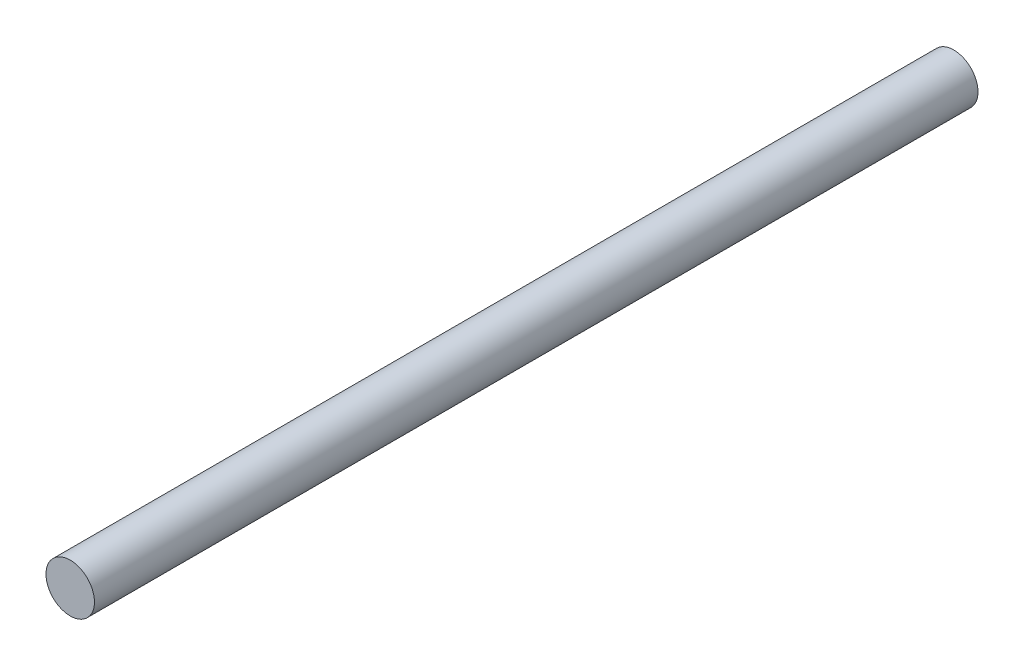
ISO-10303-21;
HEADER;
FILE_DESCRIPTION(('STEP AP214'),'2;1');
FILE_NAME('part.step','',(''),(''),'','','');
FILE_SCHEMA(('AUTOMOTIVE_DESIGN { 1 0 10303 214 1 1 1 1 }'));
ENDSEC;
DATA;
#1=APPLICATION_CONTEXT('core data for automotive mechanical design processes');
#2=APPLICATION_PROTOCOL_DEFINITION('international standard','automotive_design',2000,#1);
#3=PRODUCT_CONTEXT('',#1,'mechanical');
#4=PRODUCT('Part','Part','',(#3));
#5=PRODUCT_RELATED_PRODUCT_CATEGORY('part','',(#4));
#6=PRODUCT_DEFINITION_FORMATION('','',#4);
#7=PRODUCT_DEFINITION_CONTEXT('part definition',#1,'design');
#8=PRODUCT_DEFINITION('design','',#6,#7);
#9=PRODUCT_DEFINITION_SHAPE('','',#8);
#10=(LENGTH_UNIT() NAMED_UNIT(*) SI_UNIT(.MILLI.,.METRE.));
#11=(NAMED_UNIT(*) PLANE_ANGLE_UNIT() SI_UNIT($,.RADIAN.));
#12=(NAMED_UNIT(*) SI_UNIT($,.STERADIAN.) SOLID_ANGLE_UNIT());
#13=UNCERTAINTY_MEASURE_WITH_UNIT(LENGTH_MEASURE(1.E-05),#10,'distance_accuracy_value','');
#14=(GEOMETRIC_REPRESENTATION_CONTEXT(3) GLOBAL_UNCERTAINTY_ASSIGNED_CONTEXT((#13)) GLOBAL_UNIT_ASSIGNED_CONTEXT((#10,
#11,#12)) REPRESENTATION_CONTEXT('',''));
#15=CARTESIAN_POINT('',(0.,0.,0.));
#16=DIRECTION('',(0.,0.,1.));
#17=DIRECTION('',(1.,0.,0.));
#18=AXIS2_PLACEMENT_3D('',#15,#16,#17);
#19=CARTESIAN_POINT('',(0.,0.,29.1815438248219));
#20=DIRECTION('',(0.,0.,1.));
#21=DIRECTION('',(1.,0.,0.));
#22=AXIS2_PLACEMENT_3D('',#19,#20,#21);
#23=PLANE('',#22);
#24=CARTESIAN_POINT('',(0.,0.,29.1815438248219));
#25=DIRECTION('',(0.,0.,-1.));
#26=DIRECTION('',(-1.,0.,0.));
#27=AXIS2_PLACEMENT_3D('',#24,#25,#26);
#28=CIRCLE('',#27,1.6);
#29=CARTESIAN_POINT('',(-1.6,0.,29.1815438248219));
#30=VERTEX_POINT('',#29);
#31=EDGE_CURVE('E9',#30,#30,#28,.T.);
#32=ORIENTED_EDGE('',*,*,#31,.F.);
#33=EDGE_LOOP('',(#32));
#34=FACE_BOUND('',#33,.T.);
#35=ADVANCED_FACE('F14',(#34),#23,.T.);
#36=CARTESIAN_POINT('',(0.,0.,-29.1815438248219));
#37=DIRECTION('',(0.,0.,-1.));
#38=DIRECTION('',(-1.,0.,0.));
#39=AXIS2_PLACEMENT_3D('',#36,#37,#38);
#40=PLANE('',#39);
#41=CARTESIAN_POINT('',(0.,0.,-29.1815438248219));
#42=DIRECTION('',(0.,0.,1.));
#43=DIRECTION('',(1.,0.,0.));
#44=AXIS2_PLACEMENT_3D('',#41,#42,#43);
#45=CIRCLE('',#44,1.6);
#46=CARTESIAN_POINT('',(1.6,0.,-29.1815438248219));
#47=VERTEX_POINT('',#46);
#48=EDGE_CURVE('E21',#47,#47,#45,.T.);
#49=ORIENTED_EDGE('',*,*,#48,.F.);
#50=EDGE_LOOP('',(#49));
#51=FACE_BOUND('',#50,.T.);
#52=ADVANCED_FACE('F29',(#51),#40,.T.);
#53=CARTESIAN_POINT('',(0.,0.,-29.1815438248219));
#54=DIRECTION('',(0.,0.,1.));
#55=DIRECTION('',(1.,0.,0.));
#56=AXIS2_PLACEMENT_3D('',#53,#54,#55);
#57=CYLINDRICAL_SURFACE('',#56,1.6);
#58=ORIENTED_EDGE('',*,*,#31,.T.);
#59=EDGE_LOOP('',(#58));
#60=FACE_BOUND('',#59,.T.);
#61=ORIENTED_EDGE('',*,*,#48,.T.);
#62=EDGE_LOOP('',(#61));
#63=FACE_BOUND('',#62,.T.);
#64=ADVANCED_FACE('F16',(#60,#63),#57,.T.);
#65=CLOSED_SHELL('',(#35,#52,#64));
#66=MANIFOLD_SOLID_BREP('B1',#65);
#67=ADVANCED_BREP_SHAPE_REPRESENTATION('',(#18,#66),#14);
#68=SHAPE_DEFINITION_REPRESENTATION(#9,#67);
ENDSEC;
END-ISO-10303-21;
